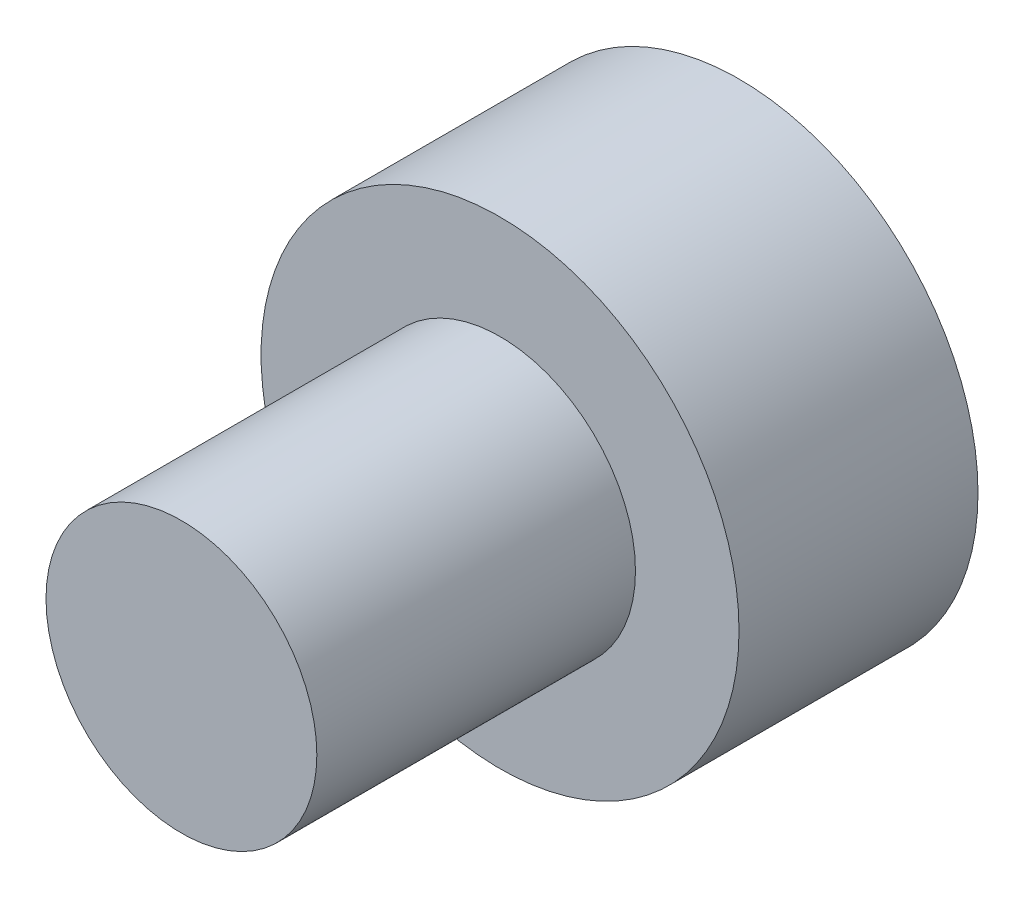
ISO-10303-21;
HEADER;
FILE_DESCRIPTION(('STEP AP214'),'2;1');
FILE_NAME('part.step','',(''),(''),'','','');
FILE_SCHEMA(('AUTOMOTIVE_DESIGN { 1 0 10303 214 1 1 1 1 }'));
ENDSEC;
DATA;
#1=APPLICATION_CONTEXT('core data for automotive mechanical design processes');
#2=APPLICATION_PROTOCOL_DEFINITION('international standard','automotive_design',2000,#1);
#3=PRODUCT_CONTEXT('',#1,'mechanical');
#4=PRODUCT('Part','Part','',(#3));
#5=PRODUCT_RELATED_PRODUCT_CATEGORY('part','',(#4));
#6=PRODUCT_DEFINITION_FORMATION('','',#4);
#7=PRODUCT_DEFINITION_CONTEXT('part definition',#1,'design');
#8=PRODUCT_DEFINITION('design','',#6,#7);
#9=PRODUCT_DEFINITION_SHAPE('','',#8);
#10=(LENGTH_UNIT() NAMED_UNIT(*) SI_UNIT(.MILLI.,.METRE.));
#11=(NAMED_UNIT(*) PLANE_ANGLE_UNIT() SI_UNIT($,.RADIAN.));
#12=(NAMED_UNIT(*) SI_UNIT($,.STERADIAN.) SOLID_ANGLE_UNIT());
#13=UNCERTAINTY_MEASURE_WITH_UNIT(LENGTH_MEASURE(1.E-05),#10,'distance_accuracy_value','');
#14=(GEOMETRIC_REPRESENTATION_CONTEXT(3) GLOBAL_UNCERTAINTY_ASSIGNED_CONTEXT((#13)) GLOBAL_UNIT_ASSIGNED_CONTEXT((#10,
#11,#12)) REPRESENTATION_CONTEXT('',''));
#15=CARTESIAN_POINT('',(0.,0.,0.));
#16=DIRECTION('',(0.,0.,1.));
#17=DIRECTION('',(1.,0.,0.));
#18=AXIS2_PLACEMENT_3D('',#15,#16,#17);
#19=CARTESIAN_POINT('',(0.,0.,3.));
#20=DIRECTION('',(0.,0.,-1.));
#21=DIRECTION('',(-1.,0.,0.));
#22=AXIS2_PLACEMENT_3D('',#19,#20,#21);
#23=CYLINDRICAL_SURFACE('',#22,3.);
#24=CARTESIAN_POINT('',(0.,0.,3.));
#25=DIRECTION('',(0.,0.,1.));
#26=DIRECTION('',(1.,0.,0.));
#27=AXIS2_PLACEMENT_3D('',#24,#25,#26);
#28=CIRCLE('',#27,3.);
#29=CARTESIAN_POINT('',(3.,0.,3.));
#30=VERTEX_POINT('',#29);
#31=EDGE_CURVE('E45',#30,#30,#28,.T.);
#32=ORIENTED_EDGE('',*,*,#31,.F.);
#33=EDGE_LOOP('',(#32));
#34=FACE_BOUND('',#33,.T.);
#35=CARTESIAN_POINT('',(0.,0.,0.));
#36=DIRECTION('',(0.,0.,1.));
#37=DIRECTION('',(1.,0.,0.));
#38=AXIS2_PLACEMENT_3D('',#35,#36,#37);
#39=CIRCLE('',#38,3.);
#40=CARTESIAN_POINT('',(3.,0.,0.));
#41=VERTEX_POINT('',#40);
#42=EDGE_CURVE('E40',#41,#41,#39,.T.);
#43=ORIENTED_EDGE('',*,*,#42,.T.);
#44=EDGE_LOOP('',(#43));
#45=FACE_BOUND('',#44,.T.);
#46=ADVANCED_FACE('F37',(#34,#45),#23,.T.);
#47=CARTESIAN_POINT('',(0.,0.,3.));
#48=DIRECTION('',(0.,0.,1.));
#49=DIRECTION('',(1.,0.,0.));
#50=AXIS2_PLACEMENT_3D('',#47,#48,#49);
#51=PLANE('',#50);
#52=CARTESIAN_POINT('',(0.,0.,3.));
#53=DIRECTION('',(0.,0.,1.));
#54=DIRECTION('',(1.,0.,0.));
#55=AXIS2_PLACEMENT_3D('',#52,#53,#54);
#56=CIRCLE('',#55,1.7);
#57=CARTESIAN_POINT('',(1.7,0.,3.));
#58=VERTEX_POINT('',#57);
#59=EDGE_CURVE('E10',#58,#58,#56,.T.);
#60=ORIENTED_EDGE('',*,*,#59,.F.);
#61=EDGE_LOOP('',(#60));
#62=FACE_BOUND('',#61,.T.);
#63=ORIENTED_EDGE('',*,*,#31,.T.);
#64=EDGE_LOOP('',(#63));
#65=FACE_BOUND('',#64,.T.);
#66=ADVANCED_FACE('F78',(#62,#65),#51,.T.);
#67=CARTESIAN_POINT('',(0.,0.,0.));
#68=DIRECTION('',(0.,0.,1.));
#69=DIRECTION('',(1.,0.,0.));
#70=AXIS2_PLACEMENT_3D('',#67,#68,#69);
#71=PLANE('',#70);
#72=CARTESIAN_POINT('',(0.,0.,0.));
#73=DIRECTION('',(0.,0.,-1.));
#74=DIRECTION('',(-1.,0.,0.));
#75=AXIS2_PLACEMENT_3D('',#72,#73,#74);
#76=CIRCLE('',#75,2.);
#77=CARTESIAN_POINT('',(-2.,0.,0.));
#78=VERTEX_POINT('',#77);
#79=EDGE_CURVE('E57',#78,#78,#76,.T.);
#80=ORIENTED_EDGE('',*,*,#79,.F.);
#81=EDGE_LOOP('',(#80));
#82=FACE_BOUND('',#81,.T.);
#83=ORIENTED_EDGE('',*,*,#42,.F.);
#84=EDGE_LOOP('',(#83));
#85=FACE_BOUND('',#84,.T.);
#86=ADVANCED_FACE('F74',(#82,#85),#71,.F.);
#87=CARTESIAN_POINT('',(0.,0.,7.));
#88=DIRECTION('',(0.,0.,-1.));
#89=DIRECTION('',(-1.,0.,0.));
#90=AXIS2_PLACEMENT_3D('',#87,#88,#89);
#91=CYLINDRICAL_SURFACE('',#90,1.7);
#92=CARTESIAN_POINT('',(0.,0.,7.));
#93=DIRECTION('',(0.,0.,1.));
#94=DIRECTION('',(1.,0.,0.));
#95=AXIS2_PLACEMENT_3D('',#92,#93,#94);
#96=CIRCLE('',#95,1.7);
#97=CARTESIAN_POINT('',(1.7,0.,7.));
#98=VERTEX_POINT('',#97);
#99=EDGE_CURVE('E52',#98,#98,#96,.T.);
#100=ORIENTED_EDGE('',*,*,#99,.F.);
#101=EDGE_LOOP('',(#100));
#102=FACE_BOUND('',#101,.T.);
#103=ORIENTED_EDGE('',*,*,#59,.T.);
#104=EDGE_LOOP('',(#103));
#105=FACE_BOUND('',#104,.T.);
#106=ADVANCED_FACE('F77',(#102,#105),#91,.T.);
#107=CARTESIAN_POINT('',(0.,0.,7.));
#108=DIRECTION('',(0.,0.,1.));
#109=DIRECTION('',(1.,0.,0.));
#110=AXIS2_PLACEMENT_3D('',#107,#108,#109);
#111=PLANE('',#110);
#112=ORIENTED_EDGE('',*,*,#99,.T.);
#113=EDGE_LOOP('',(#112));
#114=FACE_BOUND('',#113,.T.);
#115=ADVANCED_FACE('F70',(#114),#111,.T.);
#116=CARTESIAN_POINT('',(0.,0.,0.2));
#117=DIRECTION('',(0.,0.,-1.));
#118=DIRECTION('',(-1.,0.,0.));
#119=AXIS2_PLACEMENT_3D('',#116,#117,#118);
#120=CYLINDRICAL_SURFACE('',#119,2.);
#121=CARTESIAN_POINT('',(0.,0.,0.2));
#122=DIRECTION('',(0.,0.,-1.));
#123=DIRECTION('',(-1.,0.,0.));
#124=AXIS2_PLACEMENT_3D('',#121,#122,#123);
#125=CIRCLE('',#124,2.);
#126=CARTESIAN_POINT('',(-2.,0.,0.2));
#127=VERTEX_POINT('',#126);
#128=EDGE_CURVE('E56',#127,#127,#125,.T.);
#129=ORIENTED_EDGE('',*,*,#128,.F.);
#130=EDGE_LOOP('',(#129));
#131=FACE_BOUND('',#130,.T.);
#132=ORIENTED_EDGE('',*,*,#79,.T.);
#133=EDGE_LOOP('',(#132));
#134=FACE_BOUND('',#133,.T.);
#135=ADVANCED_FACE('F67',(#131,#134),#120,.F.);
#136=CARTESIAN_POINT('',(0.,0.,0.2));
#137=DIRECTION('',(0.,0.,-1.));
#138=DIRECTION('',(-1.,0.,0.));
#139=AXIS2_PLACEMENT_3D('',#136,#137,#138);
#140=PLANE('',#139);
#141=ORIENTED_EDGE('',*,*,#128,.T.);
#142=EDGE_LOOP('',(#141));
#143=FACE_BOUND('',#142,.T.);
#144=ADVANCED_FACE('F65',(#143),#140,.T.);
#145=CLOSED_SHELL('',(#46,#66,#86,#106,#115,#135,#144));
#146=MANIFOLD_SOLID_BREP('B2',#145);
#147=ADVANCED_BREP_SHAPE_REPRESENTATION('',(#18,#146),#14);
#148=SHAPE_DEFINITION_REPRESENTATION(#9,#147);
ENDSEC;
END-ISO-10303-21;
